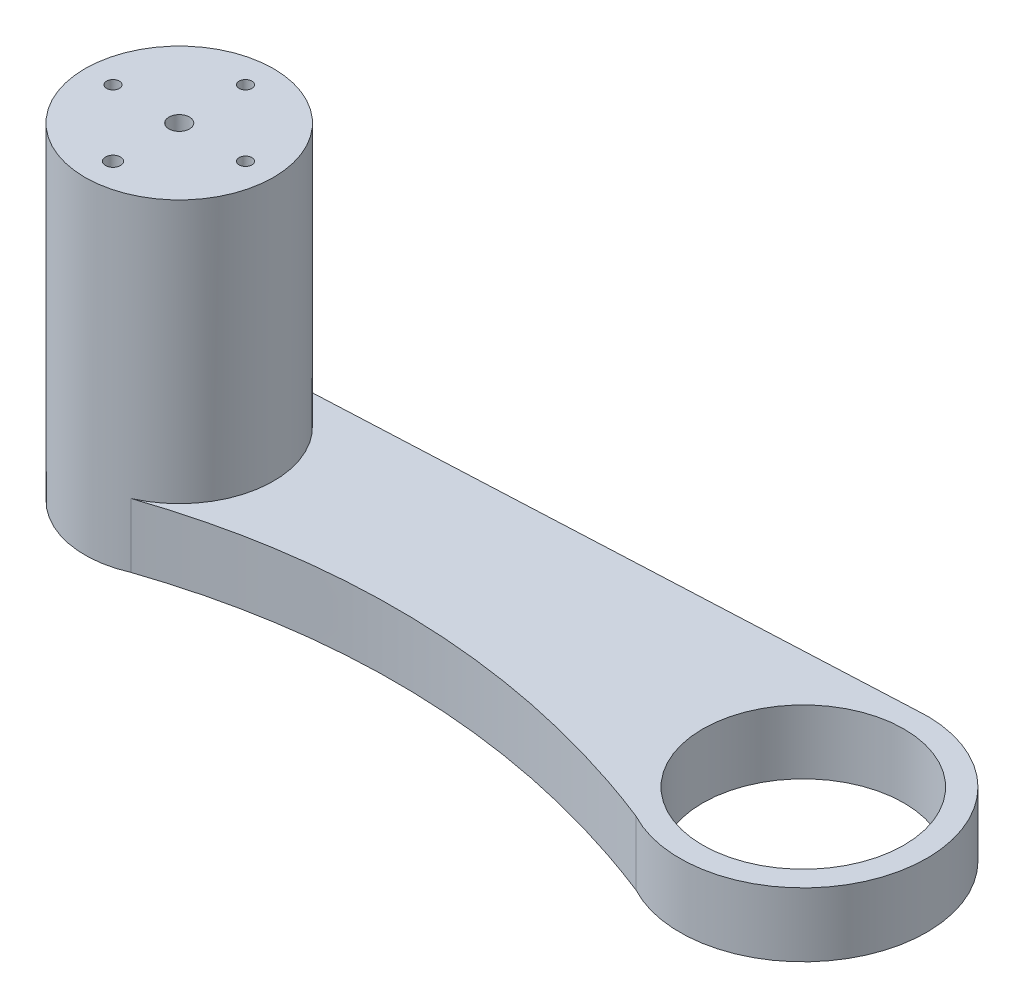
ISO-10303-21;
HEADER;
FILE_DESCRIPTION(('STEP AP214'),'2;1');
FILE_NAME('part.step','',(''),(''),'','','');
FILE_SCHEMA(('AUTOMOTIVE_DESIGN { 1 0 10303 214 1 1 1 1 }'));
ENDSEC;
DATA;
#1=APPLICATION_CONTEXT('core data for automotive mechanical design processes');
#2=APPLICATION_PROTOCOL_DEFINITION('international standard','automotive_design',2000,#1);
#3=PRODUCT_CONTEXT('',#1,'mechanical');
#4=PRODUCT('Part','Part','',(#3));
#5=PRODUCT_RELATED_PRODUCT_CATEGORY('part','',(#4));
#6=PRODUCT_DEFINITION_FORMATION('','',#4);
#7=PRODUCT_DEFINITION_CONTEXT('part definition',#1,'design');
#8=PRODUCT_DEFINITION('design','',#6,#7);
#9=PRODUCT_DEFINITION_SHAPE('','',#8);
#10=(LENGTH_UNIT() NAMED_UNIT(*) SI_UNIT(.MILLI.,.METRE.));
#11=(NAMED_UNIT(*) PLANE_ANGLE_UNIT() SI_UNIT($,.RADIAN.));
#12=(NAMED_UNIT(*) SI_UNIT($,.STERADIAN.) SOLID_ANGLE_UNIT());
#13=UNCERTAINTY_MEASURE_WITH_UNIT(LENGTH_MEASURE(1.E-05),#10,'distance_accuracy_value','');
#14=(GEOMETRIC_REPRESENTATION_CONTEXT(3) GLOBAL_UNCERTAINTY_ASSIGNED_CONTEXT((#13)) GLOBAL_UNIT_ASSIGNED_CONTEXT((#10,
#11,#12)) REPRESENTATION_CONTEXT('',''));
#15=CARTESIAN_POINT('',(0.,0.,0.));
#16=DIRECTION('',(0.,0.,1.));
#17=DIRECTION('',(1.,0.,0.));
#18=AXIS2_PLACEMENT_3D('',#15,#16,#17);
#19=CARTESIAN_POINT('',(0.,-35.75,0.));
#20=DIRECTION('',(0.,1.,0.));
#21=DIRECTION('',(0.,0.,-1.));
#22=AXIS2_PLACEMENT_3D('',#19,#20,#21);
#23=CYLINDRICAL_SURFACE('',#22,10.3);
#24=CARTESIAN_POINT('',(0.,-28.75,0.));
#25=DIRECTION('',(0.,-1.,0.));
#26=DIRECTION('',(0.,0.,-1.));
#27=AXIS2_PLACEMENT_3D('',#24,#25,#26);
#28=CIRCLE('',#27,10.3);
#29=CARTESIAN_POINT('',(0.,-28.75,-10.3));
#30=VERTEX_POINT('',#29);
#31=CARTESIAN_POINT('',(4.16990453527767,-28.75,9.41816840827721));
#32=VERTEX_POINT('',#31);
#33=EDGE_CURVE('E113',#30,#32,#28,.T.);
#34=ORIENTED_EDGE('',*,*,#33,.F.);
#35=DIRECTION('',(0.,-1.,0.));
#36=VECTOR('',#35,1.);
#37=CARTESIAN_POINT('',(0.,-28.75,-10.3));
#38=LINE('',#37,#36);
#39=CARTESIAN_POINT('',(0.,-35.75,-10.3));
#40=VERTEX_POINT('',#39);
#41=EDGE_CURVE('E106',#30,#40,#38,.T.);
#42=ORIENTED_EDGE('',*,*,#41,.T.);
#43=CARTESIAN_POINT('',(0.,-35.75,0.));
#44=DIRECTION('',(0.,1.,0.));
#45=DIRECTION('',(0.,0.,1.));
#46=AXIS2_PLACEMENT_3D('',#43,#44,#45);
#47=CIRCLE('',#46,10.3);
#48=CARTESIAN_POINT('',(4.16990453527767,-35.75,9.41816840827721));
#49=VERTEX_POINT('',#48);
#50=EDGE_CURVE('E11',#40,#49,#47,.T.);
#51=ORIENTED_EDGE('',*,*,#50,.T.);
#52=DIRECTION('',(0.,-1.,0.));
#53=VECTOR('',#52,1.);
#54=CARTESIAN_POINT('',(4.16990453527767,-28.75,9.41816840827721));
#55=LINE('',#54,#53);
#56=EDGE_CURVE('E130',#32,#49,#55,.T.);
#57=ORIENTED_EDGE('',*,*,#56,.F.);
#58=EDGE_LOOP('',(#34,#42,#51,#57));
#59=FACE_BOUND('',#58,.T.);
#60=CARTESIAN_POINT('',(0.,0.,0.));
#61=DIRECTION('',(0.,1.,0.));
#62=DIRECTION('',(0.,0.,1.));
#63=AXIS2_PLACEMENT_3D('',#60,#61,#62);
#64=CIRCLE('',#63,10.3);
#65=CARTESIAN_POINT('',(0.,0.,10.3));
#66=VERTEX_POINT('',#65);
#67=EDGE_CURVE('E53',#66,#66,#64,.T.);
#68=ORIENTED_EDGE('',*,*,#67,.F.);
#69=EDGE_LOOP('',(#68));
#70=FACE_BOUND('',#69,.T.);
#71=ADVANCED_FACE('F44',(#59,#70),#23,.T.);
#72=CARTESIAN_POINT('',(0.,-35.75,0.));
#73=DIRECTION('',(0.,-1.,0.));
#74=DIRECTION('',(0.,0.,1.));
#75=AXIS2_PLACEMENT_3D('',#72,#73,#74);
#76=PLANE('',#75);
#77=CARTESIAN_POINT('',(68.2073015610216,-35.75,0.));
#78=DIRECTION('',(0.,1.,0.));
#79=DIRECTION('',(0.,0.,1.));
#80=AXIS2_PLACEMENT_3D('',#77,#78,#79);
#81=CIRCLE('',#80,11.);
#82=CARTESIAN_POINT('',(68.2073015610216,-35.75,11.));
#83=VERTEX_POINT('',#82);
#84=EDGE_CURVE('E175',#83,#83,#81,.T.);
#85=ORIENTED_EDGE('',*,*,#84,.T.);
#86=EDGE_LOOP('',(#85));
#87=FACE_BOUND('',#86,.T.);
#88=CARTESIAN_POINT('',(0.,-35.75,0.));
#89=DIRECTION('',(0.,-1.,0.));
#90=DIRECTION('',(0.,0.,-1.));
#91=AXIS2_PLACEMENT_3D('',#88,#89,#90);
#92=CIRCLE('',#91,1.12499999999999);
#93=CARTESIAN_POINT('',(0.,-35.75,-1.12499999999999));
#94=VERTEX_POINT('',#93);
#95=EDGE_CURVE('E141',#94,#94,#92,.T.);
#96=ORIENTED_EDGE('',*,*,#95,.F.);
#97=EDGE_LOOP('',(#96));
#98=FACE_BOUND('',#97,.T.);
#99=ORIENTED_EDGE('',*,*,#50,.F.);
#100=DIRECTION('',(-0.998901267413146,0.,0.0468642503451384));
#101=VECTOR('',#100,1.);
#102=CARTESIAN_POINT('',(66.9433570662362,-35.75,-13.4407010350689));
#103=LINE('',#102,#101);
#104=CARTESIAN_POINT('',(66.9433570662362,-35.75,-13.4407010350689));
#105=VERTEX_POINT('',#104);
#106=EDGE_CURVE('E61',#105,#40,#103,.T.);
#107=ORIENTED_EDGE('',*,*,#106,.F.);
#108=CARTESIAN_POINT('',(68.2073015610216,-35.75,0.));
#109=DIRECTION('',(0.,1.,0.));
#110=DIRECTION('',(0.,0.,1.));
#111=AXIS2_PLACEMENT_3D('',#108,#109,#110);
#112=CIRCLE('',#111,13.5);
#113=CARTESIAN_POINT('',(61.8200064973479,-35.75,11.8933789046499));
#114=VERTEX_POINT('',#113);
#115=EDGE_CURVE('E104',#114,#105,#112,.T.);
#116=ORIENTED_EDGE('',*,*,#115,.F.);
#117=CARTESIAN_POINT('',(4.16990453527767,-35.75,9.41816840827721));
#118=CARTESIAN_POINT('',(22.46177603715,-35.75,3.24596138026616));
#119=CARTESIAN_POINT('',(41.93415181531,-35.75,4.07724305719363));
#120=CARTESIAN_POINT('',(61.8200064973479,-35.75,11.8933789046499));
#121=B_SPLINE_CURVE_WITH_KNOTS('',3,(#117,#118,#119,#120),.UNSPECIFIED.,.F.,.F.,(4,4),(0.,1.),.UNSPECIFIED.);
#122=EDGE_CURVE('E87',#49,#114,#121,.T.);
#123=ORIENTED_EDGE('',*,*,#122,.F.);
#124=EDGE_LOOP('',(#99,#107,#116,#123));
#125=FACE_BOUND('',#124,.T.);
#126=ADVANCED_FACE('F151',(#87,#98,#125),#76,.T.);
#127=CARTESIAN_POINT('',(0.,0.,0.));
#128=DIRECTION('',(0.,-1.,0.));
#129=DIRECTION('',(0.,0.,1.));
#130=AXIS2_PLACEMENT_3D('',#127,#128,#129);
#131=PLANE('',#130);
#132=CARTESIAN_POINT('',(0.,0.,-7.24));
#133=DIRECTION('',(0.,1.,0.));
#134=DIRECTION('',(0.,0.,1.));
#135=AXIS2_PLACEMENT_3D('',#132,#133,#134);
#136=CIRCLE('',#135,0.7);
#137=CARTESIAN_POINT('',(0.,0.,-6.54));
#138=VERTEX_POINT('',#137);
#139=EDGE_CURVE('E207',#138,#138,#136,.T.);
#140=ORIENTED_EDGE('',*,*,#139,.F.);
#141=EDGE_LOOP('',(#140));
#142=FACE_BOUND('',#141,.T.);
#143=CARTESIAN_POINT('',(0.,0.,7.24));
#144=DIRECTION('',(0.,1.,0.));
#145=DIRECTION('',(0.,0.,1.));
#146=AXIS2_PLACEMENT_3D('',#143,#144,#145);
#147=CIRCLE('',#146,0.820346338278009);
#148=CARTESIAN_POINT('',(0.,0.,8.06034633827801));
#149=VERTEX_POINT('',#148);
#150=EDGE_CURVE('E203',#149,#149,#147,.T.);
#151=ORIENTED_EDGE('',*,*,#150,.F.);
#152=EDGE_LOOP('',(#151));
#153=FACE_BOUND('',#152,.T.);
#154=CARTESIAN_POINT('',(7.24,0.,0.));
#155=DIRECTION('',(0.,1.,0.));
#156=DIRECTION('',(0.,0.,1.));
#157=AXIS2_PLACEMENT_3D('',#154,#155,#156);
#158=CIRCLE('',#157,0.7);
#159=CARTESIAN_POINT('',(7.24,0.,0.7));
#160=VERTEX_POINT('',#159);
#161=EDGE_CURVE('E195',#160,#160,#158,.T.);
#162=ORIENTED_EDGE('',*,*,#161,.F.);
#163=EDGE_LOOP('',(#162));
#164=FACE_BOUND('',#163,.T.);
#165=CARTESIAN_POINT('',(-7.24,0.,0.));
#166=DIRECTION('',(0.,1.,0.));
#167=DIRECTION('',(0.,0.,1.));
#168=AXIS2_PLACEMENT_3D('',#165,#166,#167);
#169=CIRCLE('',#168,0.7);
#170=CARTESIAN_POINT('',(-7.24,0.,0.7));
#171=VERTEX_POINT('',#170);
#172=EDGE_CURVE('E187',#171,#171,#169,.T.);
#173=ORIENTED_EDGE('',*,*,#172,.F.);
#174=EDGE_LOOP('',(#173));
#175=FACE_BOUND('',#174,.T.);
#176=CARTESIAN_POINT('',(0.,0.,0.));
#177=DIRECTION('',(0.,-1.,0.));
#178=DIRECTION('',(0.,0.,-1.));
#179=AXIS2_PLACEMENT_3D('',#176,#177,#178);
#180=CIRCLE('',#179,1.125);
#181=CARTESIAN_POINT('',(0.,0.,-1.125));
#182=VERTEX_POINT('',#181);
#183=EDGE_CURVE('E133',#182,#182,#180,.T.);
#184=ORIENTED_EDGE('',*,*,#183,.T.);
#185=EDGE_LOOP('',(#184));
#186=FACE_BOUND('',#185,.T.);
#187=ORIENTED_EDGE('',*,*,#67,.T.);
#188=EDGE_LOOP('',(#187));
#189=FACE_BOUND('',#188,.T.);
#190=ADVANCED_FACE('F148',(#142,#153,#164,#175,#186,#189),#131,.F.);
#191=CARTESIAN_POINT('',(0.,0.,0.));
#192=DIRECTION('',(0.,1.,0.));
#193=DIRECTION('',(0.,0.,-1.));
#194=AXIS2_PLACEMENT_3D('',#191,#192,#193);
#195=CYLINDRICAL_SURFACE('',#194,1.12499999999999);
#196=ORIENTED_EDGE('',*,*,#95,.T.);
#197=EDGE_LOOP('',(#196));
#198=FACE_BOUND('',#197,.T.);
#199=ORIENTED_EDGE('',*,*,#183,.F.);
#200=EDGE_LOOP('',(#199));
#201=FACE_BOUND('',#200,.T.);
#202=ADVANCED_FACE('F160',(#198,#201),#195,.F.);
#203=CARTESIAN_POINT('',(4.16990453527767,-28.75,9.41816840827721));
#204=CARTESIAN_POINT('',(22.46177603715,-28.75,3.24596138026616));
#205=CARTESIAN_POINT('',(41.93415181531,-28.75,4.07724305719363));
#206=CARTESIAN_POINT('',(61.8200064973479,-28.75,11.8933789046499));
#207=B_SPLINE_CURVE_WITH_KNOTS('',3,(#203,#204,#205,#206),.UNSPECIFIED.,.F.,.F.,(4,4),(0.,1.),.UNSPECIFIED.);
#208=DIRECTION('',(0.,-1.,0.));
#209=VECTOR('',#208,1.);
#210=SURFACE_OF_LINEAR_EXTRUSION('',#207,#209);
#211=ORIENTED_EDGE('',*,*,#122,.T.);
#212=DIRECTION('',(0.,-1.,0.));
#213=VECTOR('',#212,1.);
#214=CARTESIAN_POINT('',(61.8200064973479,-28.75,11.8933789046499));
#215=LINE('',#214,#213);
#216=CARTESIAN_POINT('',(61.8200064973479,-28.75,11.8933789046499));
#217=VERTEX_POINT('',#216);
#218=EDGE_CURVE('E107',#217,#114,#215,.T.);
#219=ORIENTED_EDGE('',*,*,#218,.F.);
#220=EDGE_CURVE('E70',#32,#217,#207,.T.);
#221=ORIENTED_EDGE('',*,*,#220,.F.);
#222=ORIENTED_EDGE('',*,*,#56,.T.);
#223=EDGE_LOOP('',(#211,#219,#221,#222));
#224=FACE_BOUND('',#223,.T.);
#225=ADVANCED_FACE('F158',(#224),#210,.F.);
#226=CARTESIAN_POINT('',(66.9433570662362,-28.75,-13.4407010350689));
#227=DIRECTION('',(-0.0468642503451384,0.,-0.998901267413145));
#228=DIRECTION('',(-0.998901267413146,0.,0.0468642503451384));
#229=AXIS2_PLACEMENT_3D('',#226,#227,#228);
#230=PLANE('',#229);
#231=ORIENTED_EDGE('',*,*,#106,.T.);
#232=ORIENTED_EDGE('',*,*,#41,.F.);
#233=DIRECTION('',(-0.998901267413146,0.,0.0468642503451384));
#234=VECTOR('',#233,1.);
#235=CARTESIAN_POINT('',(66.9433570662362,-28.75,-13.4407010350689));
#236=LINE('',#235,#234);
#237=CARTESIAN_POINT('',(66.9433570662362,-28.75,-13.4407010350689));
#238=VERTEX_POINT('',#237);
#239=EDGE_CURVE('E98',#238,#30,#236,.T.);
#240=ORIENTED_EDGE('',*,*,#239,.F.);
#241=DIRECTION('',(0.,-1.,0.));
#242=VECTOR('',#241,1.);
#243=CARTESIAN_POINT('',(66.9433570662362,-28.75,-13.4407010350689));
#244=LINE('',#243,#242);
#245=EDGE_CURVE('E102',#238,#105,#244,.T.);
#246=ORIENTED_EDGE('',*,*,#245,.T.);
#247=EDGE_LOOP('',(#231,#232,#240,#246));
#248=FACE_BOUND('',#247,.T.);
#249=ADVANCED_FACE('F109',(#248),#230,.T.);
#250=CARTESIAN_POINT('',(68.2073015610216,-28.75,0.));
#251=DIRECTION('',(0.,-1.,0.));
#252=DIRECTION('',(0.,0.,1.));
#253=AXIS2_PLACEMENT_3D('',#250,#251,#252);
#254=CYLINDRICAL_SURFACE('',#253,13.5);
#255=ORIENTED_EDGE('',*,*,#115,.T.);
#256=ORIENTED_EDGE('',*,*,#245,.F.);
#257=CARTESIAN_POINT('',(68.2073015610216,-28.75,0.));
#258=DIRECTION('',(0.,1.,0.));
#259=DIRECTION('',(0.,0.,1.));
#260=AXIS2_PLACEMENT_3D('',#257,#258,#259);
#261=CIRCLE('',#260,13.5);
#262=EDGE_CURVE('E93',#217,#238,#261,.T.);
#263=ORIENTED_EDGE('',*,*,#262,.F.);
#264=ORIENTED_EDGE('',*,*,#218,.T.);
#265=EDGE_LOOP('',(#255,#256,#263,#264));
#266=FACE_BOUND('',#265,.T.);
#267=ADVANCED_FACE('F103',(#266),#254,.T.);
#268=CARTESIAN_POINT('',(32.3972118237507,-28.75,5.41014507816331));
#269=DIRECTION('',(0.,-1.,0.));
#270=DIRECTION('',(0.,0.,1.));
#271=AXIS2_PLACEMENT_3D('',#268,#269,#270);
#272=PLANE('',#271);
#273=CARTESIAN_POINT('',(68.2073015610216,-28.75,0.));
#274=DIRECTION('',(0.,1.,0.));
#275=DIRECTION('',(0.,0.,1.));
#276=AXIS2_PLACEMENT_3D('',#273,#274,#275);
#277=CIRCLE('',#276,11.);
#278=CARTESIAN_POINT('',(68.2073015610216,-28.75,11.));
#279=VERTEX_POINT('',#278);
#280=EDGE_CURVE('E47',#279,#279,#277,.T.);
#281=ORIENTED_EDGE('',*,*,#280,.F.);
#282=EDGE_LOOP('',(#281));
#283=FACE_BOUND('',#282,.T.);
#284=ORIENTED_EDGE('',*,*,#220,.T.);
#285=ORIENTED_EDGE('',*,*,#262,.T.);
#286=ORIENTED_EDGE('',*,*,#239,.T.);
#287=ORIENTED_EDGE('',*,*,#33,.T.);
#288=EDGE_LOOP('',(#284,#285,#286,#287));
#289=FACE_BOUND('',#288,.T.);
#290=ADVANCED_FACE('F95',(#283,#289),#272,.F.);
#291=CARTESIAN_POINT('',(68.2073015610216,-35.75,0.));
#292=DIRECTION('',(0.,-1.,0.));
#293=DIRECTION('',(0.,0.,1.));
#294=AXIS2_PLACEMENT_3D('',#291,#292,#293);
#295=CYLINDRICAL_SURFACE('',#294,11.);
#296=ORIENTED_EDGE('',*,*,#84,.F.);
#297=EDGE_LOOP('',(#296));
#298=FACE_BOUND('',#297,.T.);
#299=ORIENTED_EDGE('',*,*,#280,.T.);
#300=EDGE_LOOP('',(#299));
#301=FACE_BOUND('',#300,.T.);
#302=ADVANCED_FACE('F238',(#298,#301),#295,.F.);
#303=CARTESIAN_POINT('',(-7.24,-7.,0.));
#304=DIRECTION('',(0.,1.,0.));
#305=DIRECTION('',(0.,0.,1.));
#306=AXIS2_PLACEMENT_3D('',#303,#304,#305);
#307=CYLINDRICAL_SURFACE('',#306,0.7);
#308=CARTESIAN_POINT('',(-7.24,-7.,0.));
#309=DIRECTION('',(0.,1.,0.));
#310=DIRECTION('',(0.,0.,1.));
#311=AXIS2_PLACEMENT_3D('',#308,#309,#310);
#312=CIRCLE('',#311,0.7);
#313=CARTESIAN_POINT('',(-7.24,-7.,0.7));
#314=VERTEX_POINT('',#313);
#315=EDGE_CURVE('E183',#314,#314,#312,.T.);
#316=ORIENTED_EDGE('',*,*,#315,.F.);
#317=EDGE_LOOP('',(#316));
#318=FACE_BOUND('',#317,.T.);
#319=ORIENTED_EDGE('',*,*,#172,.T.);
#320=EDGE_LOOP('',(#319));
#321=FACE_BOUND('',#320,.T.);
#322=ADVANCED_FACE('F235',(#318,#321),#307,.F.);
#323=CARTESIAN_POINT('',(-7.24,-7.,0.));
#324=DIRECTION('',(0.,1.,0.));
#325=DIRECTION('',(0.,0.,1.));
#326=AXIS2_PLACEMENT_3D('',#323,#324,#325);
#327=PLANE('',#326);
#328=ORIENTED_EDGE('',*,*,#315,.T.);
#329=EDGE_LOOP('',(#328));
#330=FACE_BOUND('',#329,.T.);
#331=ADVANCED_FACE('F237',(#330),#327,.T.);
#332=CARTESIAN_POINT('',(7.24,-7.,0.));
#333=DIRECTION('',(0.,1.,0.));
#334=DIRECTION('',(0.,0.,1.));
#335=AXIS2_PLACEMENT_3D('',#332,#333,#334);
#336=CYLINDRICAL_SURFACE('',#335,0.7);
#337=CARTESIAN_POINT('',(7.24,-7.,0.));
#338=DIRECTION('',(0.,1.,0.));
#339=DIRECTION('',(0.,0.,1.));
#340=AXIS2_PLACEMENT_3D('',#337,#338,#339);
#341=CIRCLE('',#340,0.7);
#342=CARTESIAN_POINT('',(7.24,-7.,0.7));
#343=VERTEX_POINT('',#342);
#344=EDGE_CURVE('E191',#343,#343,#341,.T.);
#345=ORIENTED_EDGE('',*,*,#344,.F.);
#346=EDGE_LOOP('',(#345));
#347=FACE_BOUND('',#346,.T.);
#348=ORIENTED_EDGE('',*,*,#161,.T.);
#349=EDGE_LOOP('',(#348));
#350=FACE_BOUND('',#349,.T.);
#351=ADVANCED_FACE('F244',(#347,#350),#336,.F.);
#352=CARTESIAN_POINT('',(7.24,-7.,0.));
#353=DIRECTION('',(0.,1.,0.));
#354=DIRECTION('',(0.,0.,1.));
#355=AXIS2_PLACEMENT_3D('',#352,#353,#354);
#356=PLANE('',#355);
#357=ORIENTED_EDGE('',*,*,#344,.T.);
#358=EDGE_LOOP('',(#357));
#359=FACE_BOUND('',#358,.T.);
#360=ADVANCED_FACE('F252',(#359),#356,.T.);
#361=CARTESIAN_POINT('',(0.,-7.,7.24));
#362=DIRECTION('',(0.,1.,0.));
#363=DIRECTION('',(0.,0.,1.));
#364=AXIS2_PLACEMENT_3D('',#361,#362,#363);
#365=CYLINDRICAL_SURFACE('',#364,0.820346338278009);
#366=CARTESIAN_POINT('',(0.,-7.,7.24));
#367=DIRECTION('',(0.,1.,0.));
#368=DIRECTION('',(0.,0.,1.));
#369=AXIS2_PLACEMENT_3D('',#366,#367,#368);
#370=CIRCLE('',#369,0.820346338278009);
#371=CARTESIAN_POINT('',(0.,-7.,8.06034633827801));
#372=VERTEX_POINT('',#371);
#373=EDGE_CURVE('E199',#372,#372,#370,.T.);
#374=ORIENTED_EDGE('',*,*,#373,.F.);
#375=EDGE_LOOP('',(#374));
#376=FACE_BOUND('',#375,.T.);
#377=ORIENTED_EDGE('',*,*,#150,.T.);
#378=EDGE_LOOP('',(#377));
#379=FACE_BOUND('',#378,.T.);
#380=ADVANCED_FACE('F339',(#376,#379),#365,.F.);
#381=CARTESIAN_POINT('',(0.,-7.,7.24));
#382=DIRECTION('',(0.,1.,0.));
#383=DIRECTION('',(0.,0.,1.));
#384=AXIS2_PLACEMENT_3D('',#381,#382,#383);
#385=PLANE('',#384);
#386=ORIENTED_EDGE('',*,*,#373,.T.);
#387=EDGE_LOOP('',(#386));
#388=FACE_BOUND('',#387,.T.);
#389=ADVANCED_FACE('F220',(#388),#385,.T.);
#390=CARTESIAN_POINT('',(0.,-7.,-7.24));
#391=DIRECTION('',(0.,1.,0.));
#392=DIRECTION('',(0.,0.,1.));
#393=AXIS2_PLACEMENT_3D('',#390,#391,#392);
#394=CYLINDRICAL_SURFACE('',#393,0.7);
#395=CARTESIAN_POINT('',(0.,-7.,-7.24));
#396=DIRECTION('',(0.,1.,0.));
#397=DIRECTION('',(0.,0.,1.));
#398=AXIS2_PLACEMENT_3D('',#395,#396,#397);
#399=CIRCLE('',#398,0.7);
#400=CARTESIAN_POINT('',(0.,-7.,-6.54));
#401=VERTEX_POINT('',#400);
#402=EDGE_CURVE('E182',#401,#401,#399,.T.);
#403=ORIENTED_EDGE('',*,*,#402,.F.);
#404=EDGE_LOOP('',(#403));
#405=FACE_BOUND('',#404,.T.);
#406=ORIENTED_EDGE('',*,*,#139,.T.);
#407=EDGE_LOOP('',(#406));
#408=FACE_BOUND('',#407,.T.);
#409=ADVANCED_FACE('F217',(#405,#408),#394,.F.);
#410=CARTESIAN_POINT('',(0.,-7.,-7.24));
#411=DIRECTION('',(0.,1.,0.));
#412=DIRECTION('',(0.,0.,1.));
#413=AXIS2_PLACEMENT_3D('',#410,#411,#412);
#414=PLANE('',#413);
#415=ORIENTED_EDGE('',*,*,#402,.T.);
#416=EDGE_LOOP('',(#415));
#417=FACE_BOUND('',#416,.T.);
#418=ADVANCED_FACE('F215',(#417),#414,.T.);
#419=CLOSED_SHELL('',(#71,#126,#190,#202,#225,#249,#267,#290,#302,#322,#331,#351,#360,#380,#389,
#409,#418));
#420=MANIFOLD_SOLID_BREP('B2',#419);
#421=ADVANCED_BREP_SHAPE_REPRESENTATION('',(#18,#420),#14);
#422=SHAPE_DEFINITION_REPRESENTATION(#9,#421);
ENDSEC;
END-ISO-10303-21;
